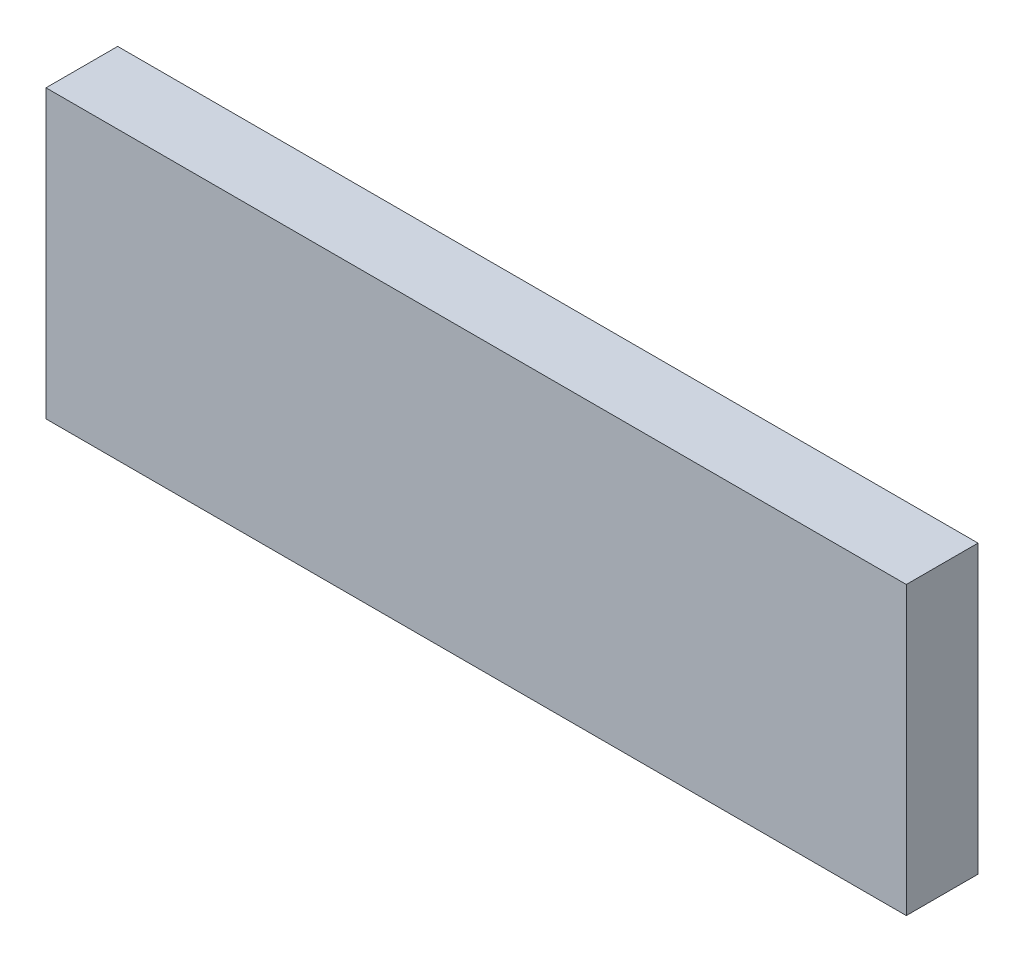
ISO-10303-21;
HEADER;
FILE_DESCRIPTION(('STEP AP214'),'2;1');
FILE_NAME('part.step','',(''),(''),'','','');
FILE_SCHEMA(('AUTOMOTIVE_DESIGN { 1 0 10303 214 1 1 1 1 }'));
ENDSEC;
DATA;
#1=APPLICATION_CONTEXT('core data for automotive mechanical design processes');
#2=APPLICATION_PROTOCOL_DEFINITION('international standard','automotive_design',2000,#1);
#3=PRODUCT_CONTEXT('',#1,'mechanical');
#4=PRODUCT('Part','Part','',(#3));
#5=PRODUCT_RELATED_PRODUCT_CATEGORY('part','',(#4));
#6=PRODUCT_DEFINITION_FORMATION('','',#4);
#7=PRODUCT_DEFINITION_CONTEXT('part definition',#1,'design');
#8=PRODUCT_DEFINITION('design','',#6,#7);
#9=PRODUCT_DEFINITION_SHAPE('','',#8);
#10=(LENGTH_UNIT() NAMED_UNIT(*) SI_UNIT(.MILLI.,.METRE.));
#11=(NAMED_UNIT(*) PLANE_ANGLE_UNIT() SI_UNIT($,.RADIAN.));
#12=(NAMED_UNIT(*) SI_UNIT($,.STERADIAN.) SOLID_ANGLE_UNIT());
#13=UNCERTAINTY_MEASURE_WITH_UNIT(LENGTH_MEASURE(1.E-05),#10,'distance_accuracy_value','');
#14=(GEOMETRIC_REPRESENTATION_CONTEXT(3) GLOBAL_UNCERTAINTY_ASSIGNED_CONTEXT((#13)) GLOBAL_UNIT_ASSIGNED_CONTEXT((#10,
#11,#12)) REPRESENTATION_CONTEXT('',''));
#15=CARTESIAN_POINT('',(0.,0.,0.));
#16=DIRECTION('',(0.,0.,1.));
#17=DIRECTION('',(1.,0.,0.));
#18=AXIS2_PLACEMENT_3D('',#15,#16,#17);
#19=CARTESIAN_POINT('',(234.,35.3959813156576,62.8606367334853));
#20=DIRECTION('',(1.,0.,0.));
#21=DIRECTION('',(0.,0.,-1.));
#22=AXIS2_PLACEMENT_3D('',#19,#20,#21);
#23=PLANE('',#22);
#24=DIRECTION('',(0.,-1.,0.));
#25=VECTOR('',#24,1.);
#26=CARTESIAN_POINT('',(234.,35.3959813156576,61.8606367334853));
#27=LINE('',#26,#25);
#28=CARTESIAN_POINT('',(234.,35.3959813156576,61.8606367334853));
#29=VERTEX_POINT('',#28);
#30=CARTESIAN_POINT('',(234.,31.3959813156576,61.8606367334853));
#31=VERTEX_POINT('',#30);
#32=EDGE_CURVE('E101',#29,#31,#27,.T.);
#33=ORIENTED_EDGE('',*,*,#32,.T.);
#34=DIRECTION('',(0.,0.,-1.));
#35=VECTOR('',#34,1.);
#36=CARTESIAN_POINT('',(234.,31.3959813156576,62.8606367334853));
#37=LINE('',#36,#35);
#38=CARTESIAN_POINT('',(234.,31.3959813156576,62.8606367334853));
#39=VERTEX_POINT('',#38);
#40=EDGE_CURVE('E11',#39,#31,#37,.T.);
#41=ORIENTED_EDGE('',*,*,#40,.F.);
#42=DIRECTION('',(0.,-1.,0.));
#43=VECTOR('',#42,1.);
#44=CARTESIAN_POINT('',(234.,35.3959813156576,62.8606367334853));
#45=LINE('',#44,#43);
#46=CARTESIAN_POINT('',(234.,35.3959813156576,62.8606367334853));
#47=VERTEX_POINT('',#46);
#48=EDGE_CURVE('E89',#47,#39,#45,.T.);
#49=ORIENTED_EDGE('',*,*,#48,.F.);
#50=DIRECTION('',(0.,0.,-1.));
#51=VECTOR('',#50,1.);
#52=CARTESIAN_POINT('',(234.,35.3959813156576,62.8606367334853));
#53=LINE('',#52,#51);
#54=EDGE_CURVE('E97',#47,#29,#53,.T.);
#55=ORIENTED_EDGE('',*,*,#54,.T.);
#56=EDGE_LOOP('',(#33,#41,#49,#55));
#57=FACE_BOUND('',#56,.T.);
#58=ADVANCED_FACE('F38',(#57),#23,.F.);
#59=CARTESIAN_POINT('',(234.,31.3959813156576,62.8606367334853));
#60=DIRECTION('',(0.,1.,0.));
#61=DIRECTION('',(0.,0.,1.));
#62=AXIS2_PLACEMENT_3D('',#59,#60,#61);
#63=PLANE('',#62);
#64=DIRECTION('',(1.,0.,0.));
#65=VECTOR('',#64,1.);
#66=CARTESIAN_POINT('',(234.,31.3959813156576,61.8606367334853));
#67=LINE('',#66,#65);
#68=CARTESIAN_POINT('',(246.,31.3959813156576,61.8606367334853));
#69=VERTEX_POINT('',#68);
#70=EDGE_CURVE('E93',#31,#69,#67,.T.);
#71=ORIENTED_EDGE('',*,*,#70,.T.);
#72=DIRECTION('',(0.,0.,-1.));
#73=VECTOR('',#72,1.);
#74=CARTESIAN_POINT('',(246.,31.3959813156576,62.8606367334853));
#75=LINE('',#74,#73);
#76=CARTESIAN_POINT('',(246.,31.3959813156576,62.8606367334853));
#77=VERTEX_POINT('',#76);
#78=EDGE_CURVE('E46',#77,#69,#75,.T.);
#79=ORIENTED_EDGE('',*,*,#78,.F.);
#80=DIRECTION('',(1.,0.,0.));
#81=VECTOR('',#80,1.);
#82=CARTESIAN_POINT('',(234.,31.3959813156576,62.8606367334853));
#83=LINE('',#82,#81);
#84=EDGE_CURVE('E84',#39,#77,#83,.T.);
#85=ORIENTED_EDGE('',*,*,#84,.F.);
#86=ORIENTED_EDGE('',*,*,#40,.T.);
#87=EDGE_LOOP('',(#71,#79,#85,#86));
#88=FACE_BOUND('',#87,.T.);
#89=ADVANCED_FACE('F92',(#88),#63,.F.);
#90=CARTESIAN_POINT('',(246.,35.3959813156576,62.8606367334853));
#91=DIRECTION('',(-1.,0.,0.));
#92=DIRECTION('',(0.,0.,1.));
#93=AXIS2_PLACEMENT_3D('',#90,#91,#92);
#94=PLANE('',#93);
#95=DIRECTION('',(0.,1.,0.));
#96=VECTOR('',#95,1.);
#97=CARTESIAN_POINT('',(246.,35.3959813156576,61.8606367334853));
#98=LINE('',#97,#96);
#99=CARTESIAN_POINT('',(246.,35.3959813156576,61.8606367334853));
#100=VERTEX_POINT('',#99);
#101=EDGE_CURVE('E71',#69,#100,#98,.T.);
#102=ORIENTED_EDGE('',*,*,#101,.T.);
#103=DIRECTION('',(0.,0.,-1.));
#104=VECTOR('',#103,1.);
#105=CARTESIAN_POINT('',(246.,35.3959813156576,62.8606367334853));
#106=LINE('',#105,#104);
#107=CARTESIAN_POINT('',(246.,35.3959813156576,62.8606367334853));
#108=VERTEX_POINT('',#107);
#109=EDGE_CURVE('E94',#108,#100,#106,.T.);
#110=ORIENTED_EDGE('',*,*,#109,.F.);
#111=DIRECTION('',(0.,1.,0.));
#112=VECTOR('',#111,1.);
#113=CARTESIAN_POINT('',(246.,35.3959813156576,62.8606367334853));
#114=LINE('',#113,#112);
#115=EDGE_CURVE('E87',#77,#108,#114,.T.);
#116=ORIENTED_EDGE('',*,*,#115,.F.);
#117=ORIENTED_EDGE('',*,*,#78,.T.);
#118=EDGE_LOOP('',(#102,#110,#116,#117));
#119=FACE_BOUND('',#118,.T.);
#120=ADVANCED_FACE('F95',(#119),#94,.F.);
#121=CARTESIAN_POINT('',(234.,35.3959813156576,62.8606367334853));
#122=DIRECTION('',(0.,-1.,0.));
#123=DIRECTION('',(0.,0.,-1.));
#124=AXIS2_PLACEMENT_3D('',#121,#122,#123);
#125=PLANE('',#124);
#126=DIRECTION('',(-1.,0.,0.));
#127=VECTOR('',#126,1.);
#128=CARTESIAN_POINT('',(234.,35.3959813156576,61.8606367334853));
#129=LINE('',#128,#127);
#130=EDGE_CURVE('E77',#100,#29,#129,.T.);
#131=ORIENTED_EDGE('',*,*,#130,.T.);
#132=ORIENTED_EDGE('',*,*,#54,.F.);
#133=DIRECTION('',(-1.,0.,0.));
#134=VECTOR('',#133,1.);
#135=CARTESIAN_POINT('',(234.,35.3959813156576,62.8606367334853));
#136=LINE('',#135,#134);
#137=EDGE_CURVE('E54',#108,#47,#136,.T.);
#138=ORIENTED_EDGE('',*,*,#137,.F.);
#139=ORIENTED_EDGE('',*,*,#109,.T.);
#140=EDGE_LOOP('',(#131,#132,#138,#139));
#141=FACE_BOUND('',#140,.T.);
#142=ADVANCED_FACE('F108',(#141),#125,.F.);
#143=CARTESIAN_POINT('',(0.,0.,62.8606367334853));
#144=DIRECTION('',(0.,0.,1.));
#145=DIRECTION('',(1.,0.,0.));
#146=AXIS2_PLACEMENT_3D('',#143,#144,#145);
#147=PLANE('',#146);
#148=ORIENTED_EDGE('',*,*,#48,.T.);
#149=ORIENTED_EDGE('',*,*,#84,.T.);
#150=ORIENTED_EDGE('',*,*,#115,.T.);
#151=ORIENTED_EDGE('',*,*,#137,.T.);
#152=EDGE_LOOP('',(#148,#149,#150,#151));
#153=FACE_BOUND('',#152,.T.);
#154=ADVANCED_FACE('F85',(#153),#147,.T.);
#155=CARTESIAN_POINT('',(0.,0.,61.8606367334853));
#156=DIRECTION('',(0.,0.,1.));
#157=DIRECTION('',(1.,0.,0.));
#158=AXIS2_PLACEMENT_3D('',#155,#156,#157);
#159=PLANE('',#158);
#160=ORIENTED_EDGE('',*,*,#32,.F.);
#161=ORIENTED_EDGE('',*,*,#130,.F.);
#162=ORIENTED_EDGE('',*,*,#101,.F.);
#163=ORIENTED_EDGE('',*,*,#70,.F.);
#164=EDGE_LOOP('',(#160,#161,#162,#163));
#165=FACE_BOUND('',#164,.T.);
#166=ADVANCED_FACE('F111',(#165),#159,.F.);
#167=CLOSED_SHELL('',(#58,#89,#120,#142,#154,#166));
#168=MANIFOLD_SOLID_BREP('B2',#167);
#169=ADVANCED_BREP_SHAPE_REPRESENTATION('',(#18,#168),#14);
#170=SHAPE_DEFINITION_REPRESENTATION(#9,#169);
ENDSEC;
END-ISO-10303-21;
